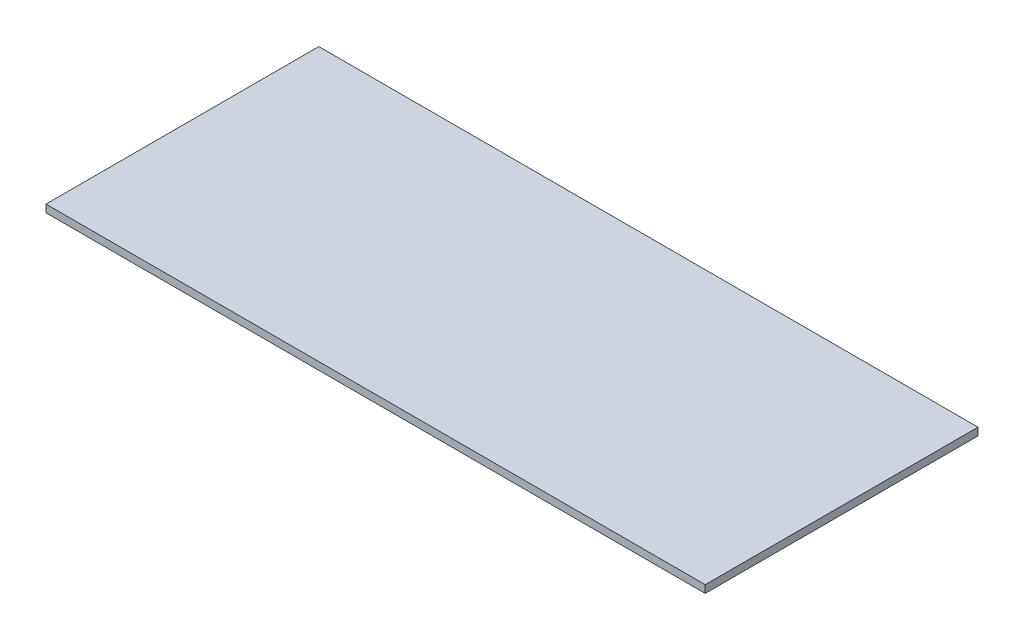
ISO-10303-21;
HEADER;
FILE_DESCRIPTION(('STEP AP214'),'2;1');
FILE_NAME('part.step','',(''),(''),'','','');
FILE_SCHEMA(('AUTOMOTIVE_DESIGN { 1 0 10303 214 1 1 1 1 }'));
ENDSEC;
DATA;
#1=APPLICATION_CONTEXT('core data for automotive mechanical design processes');
#2=APPLICATION_PROTOCOL_DEFINITION('international standard','automotive_design',2000,#1);
#3=PRODUCT_CONTEXT('',#1,'mechanical');
#4=PRODUCT('Part','Part','',(#3));
#5=PRODUCT_RELATED_PRODUCT_CATEGORY('part','',(#4));
#6=PRODUCT_DEFINITION_FORMATION('','',#4);
#7=PRODUCT_DEFINITION_CONTEXT('part definition',#1,'design');
#8=PRODUCT_DEFINITION('design','',#6,#7);
#9=PRODUCT_DEFINITION_SHAPE('','',#8);
#10=(LENGTH_UNIT() NAMED_UNIT(*) SI_UNIT(.MILLI.,.METRE.));
#11=(NAMED_UNIT(*) PLANE_ANGLE_UNIT() SI_UNIT($,.RADIAN.));
#12=(NAMED_UNIT(*) SI_UNIT($,.STERADIAN.) SOLID_ANGLE_UNIT());
#13=UNCERTAINTY_MEASURE_WITH_UNIT(LENGTH_MEASURE(1.E-05),#10,'distance_accuracy_value','');
#14=(GEOMETRIC_REPRESENTATION_CONTEXT(3) GLOBAL_UNCERTAINTY_ASSIGNED_CONTEXT((#13)) GLOBAL_UNIT_ASSIGNED_CONTEXT((#10,
#11,#12)) REPRESENTATION_CONTEXT('',''));
#15=CARTESIAN_POINT('',(0.,0.,0.));
#16=DIRECTION('',(0.,0.,1.));
#17=DIRECTION('',(1.,0.,0.));
#18=AXIS2_PLACEMENT_3D('',#15,#16,#17);
#19=CARTESIAN_POINT('',(87.,1.,36.));
#20=DIRECTION('',(-1.,0.,0.));
#21=DIRECTION('',(0.,0.,1.));
#22=AXIS2_PLACEMENT_3D('',#19,#20,#21);
#23=PLANE('',#22);
#24=DIRECTION('',(0.,0.,-1.));
#25=VECTOR('',#24,1.);
#26=CARTESIAN_POINT('',(87.,-1.,36.));
#27=LINE('',#26,#25);
#28=CARTESIAN_POINT('',(87.,-1.,36.));
#29=VERTEX_POINT('',#28);
#30=CARTESIAN_POINT('',(87.,-1.,-36.));
#31=VERTEX_POINT('',#30);
#32=EDGE_CURVE('E96',#29,#31,#27,.T.);
#33=ORIENTED_EDGE('',*,*,#32,.T.);
#34=DIRECTION('',(0.,-1.,0.));
#35=VECTOR('',#34,1.);
#36=CARTESIAN_POINT('',(87.,1.,-36.));
#37=LINE('',#36,#35);
#38=CARTESIAN_POINT('',(87.,1.,-36.));
#39=VERTEX_POINT('',#38);
#40=EDGE_CURVE('E11',#39,#31,#37,.T.);
#41=ORIENTED_EDGE('',*,*,#40,.F.);
#42=DIRECTION('',(0.,0.,-1.));
#43=VECTOR('',#42,1.);
#44=CARTESIAN_POINT('',(87.,1.,36.));
#45=LINE('',#44,#43);
#46=CARTESIAN_POINT('',(87.,1.,36.));
#47=VERTEX_POINT('',#46);
#48=EDGE_CURVE('E84',#47,#39,#45,.T.);
#49=ORIENTED_EDGE('',*,*,#48,.F.);
#50=DIRECTION('',(0.,-1.,0.));
#51=VECTOR('',#50,1.);
#52=CARTESIAN_POINT('',(87.,1.,36.));
#53=LINE('',#52,#51);
#54=EDGE_CURVE('E92',#47,#29,#53,.T.);
#55=ORIENTED_EDGE('',*,*,#54,.T.);
#56=EDGE_LOOP('',(#33,#41,#49,#55));
#57=FACE_BOUND('',#56,.T.);
#58=ADVANCED_FACE('F33',(#57),#23,.F.);
#59=CARTESIAN_POINT('',(-87.,1.,-36.));
#60=DIRECTION('',(0.,0.,1.));
#61=DIRECTION('',(1.,0.,0.));
#62=AXIS2_PLACEMENT_3D('',#59,#60,#61);
#63=PLANE('',#62);
#64=DIRECTION('',(-1.,0.,0.));
#65=VECTOR('',#64,1.);
#66=CARTESIAN_POINT('',(-87.,-1.,-36.));
#67=LINE('',#66,#65);
#68=CARTESIAN_POINT('',(-87.,-1.,-36.));
#69=VERTEX_POINT('',#68);
#70=EDGE_CURVE('E88',#31,#69,#67,.T.);
#71=ORIENTED_EDGE('',*,*,#70,.T.);
#72=DIRECTION('',(0.,-1.,0.));
#73=VECTOR('',#72,1.);
#74=CARTESIAN_POINT('',(-87.,1.,-36.));
#75=LINE('',#74,#73);
#76=CARTESIAN_POINT('',(-87.,1.,-36.));
#77=VERTEX_POINT('',#76);
#78=EDGE_CURVE('E41',#77,#69,#75,.T.);
#79=ORIENTED_EDGE('',*,*,#78,.F.);
#80=DIRECTION('',(-1.,0.,0.));
#81=VECTOR('',#80,1.);
#82=CARTESIAN_POINT('',(-87.,1.,-36.));
#83=LINE('',#82,#81);
#84=EDGE_CURVE('E79',#39,#77,#83,.T.);
#85=ORIENTED_EDGE('',*,*,#84,.F.);
#86=ORIENTED_EDGE('',*,*,#40,.T.);
#87=EDGE_LOOP('',(#71,#79,#85,#86));
#88=FACE_BOUND('',#87,.T.);
#89=ADVANCED_FACE('F87',(#88),#63,.F.);
#90=CARTESIAN_POINT('',(-87.,1.,36.));
#91=DIRECTION('',(1.,0.,0.));
#92=DIRECTION('',(0.,0.,-1.));
#93=AXIS2_PLACEMENT_3D('',#90,#91,#92);
#94=PLANE('',#93);
#95=DIRECTION('',(0.,0.,1.));
#96=VECTOR('',#95,1.);
#97=CARTESIAN_POINT('',(-87.,-1.,36.));
#98=LINE('',#97,#96);
#99=CARTESIAN_POINT('',(-87.,-1.,36.));
#100=VERTEX_POINT('',#99);
#101=EDGE_CURVE('E66',#69,#100,#98,.T.);
#102=ORIENTED_EDGE('',*,*,#101,.T.);
#103=DIRECTION('',(0.,-1.,0.));
#104=VECTOR('',#103,1.);
#105=CARTESIAN_POINT('',(-87.,1.,36.));
#106=LINE('',#105,#104);
#107=CARTESIAN_POINT('',(-87.,1.,36.));
#108=VERTEX_POINT('',#107);
#109=EDGE_CURVE('E89',#108,#100,#106,.T.);
#110=ORIENTED_EDGE('',*,*,#109,.F.);
#111=DIRECTION('',(0.,0.,1.));
#112=VECTOR('',#111,1.);
#113=CARTESIAN_POINT('',(-87.,1.,36.));
#114=LINE('',#113,#112);
#115=EDGE_CURVE('E82',#77,#108,#114,.T.);
#116=ORIENTED_EDGE('',*,*,#115,.F.);
#117=ORIENTED_EDGE('',*,*,#78,.T.);
#118=EDGE_LOOP('',(#102,#110,#116,#117));
#119=FACE_BOUND('',#118,.T.);
#120=ADVANCED_FACE('F90',(#119),#94,.F.);
#121=CARTESIAN_POINT('',(-87.,1.,36.));
#122=DIRECTION('',(0.,0.,-1.));
#123=DIRECTION('',(-1.,0.,0.));
#124=AXIS2_PLACEMENT_3D('',#121,#122,#123);
#125=PLANE('',#124);
#126=DIRECTION('',(1.,0.,0.));
#127=VECTOR('',#126,1.);
#128=CARTESIAN_POINT('',(-87.,-1.,36.));
#129=LINE('',#128,#127);
#130=EDGE_CURVE('E72',#100,#29,#129,.T.);
#131=ORIENTED_EDGE('',*,*,#130,.T.);
#132=ORIENTED_EDGE('',*,*,#54,.F.);
#133=DIRECTION('',(1.,0.,0.));
#134=VECTOR('',#133,1.);
#135=CARTESIAN_POINT('',(-87.,1.,36.));
#136=LINE('',#135,#134);
#137=EDGE_CURVE('E49',#108,#47,#136,.T.);
#138=ORIENTED_EDGE('',*,*,#137,.F.);
#139=ORIENTED_EDGE('',*,*,#109,.T.);
#140=EDGE_LOOP('',(#131,#132,#138,#139));
#141=FACE_BOUND('',#140,.T.);
#142=ADVANCED_FACE('F103',(#141),#125,.F.);
#143=CARTESIAN_POINT('',(0.,1.,0.));
#144=DIRECTION('',(0.,-1.,0.));
#145=DIRECTION('',(0.,0.,-1.));
#146=AXIS2_PLACEMENT_3D('',#143,#144,#145);
#147=PLANE('',#146);
#148=ORIENTED_EDGE('',*,*,#48,.T.);
#149=ORIENTED_EDGE('',*,*,#84,.T.);
#150=ORIENTED_EDGE('',*,*,#115,.T.);
#151=ORIENTED_EDGE('',*,*,#137,.T.);
#152=EDGE_LOOP('',(#148,#149,#150,#151));
#153=FACE_BOUND('',#152,.T.);
#154=ADVANCED_FACE('F80',(#153),#147,.F.);
#155=CARTESIAN_POINT('',(0.,-1.,0.));
#156=DIRECTION('',(0.,-1.,0.));
#157=DIRECTION('',(0.,0.,-1.));
#158=AXIS2_PLACEMENT_3D('',#155,#156,#157);
#159=PLANE('',#158);
#160=ORIENTED_EDGE('',*,*,#32,.F.);
#161=ORIENTED_EDGE('',*,*,#130,.F.);
#162=ORIENTED_EDGE('',*,*,#101,.F.);
#163=ORIENTED_EDGE('',*,*,#70,.F.);
#164=EDGE_LOOP('',(#160,#161,#162,#163));
#165=FACE_BOUND('',#164,.T.);
#166=ADVANCED_FACE('F106',(#165),#159,.T.);
#167=CLOSED_SHELL('',(#58,#89,#120,#142,#154,#166));
#168=MANIFOLD_SOLID_BREP('B2',#167);
#169=ADVANCED_BREP_SHAPE_REPRESENTATION('',(#18,#168),#14);
#170=SHAPE_DEFINITION_REPRESENTATION(#9,#169);
ENDSEC;
END-ISO-10303-21;
